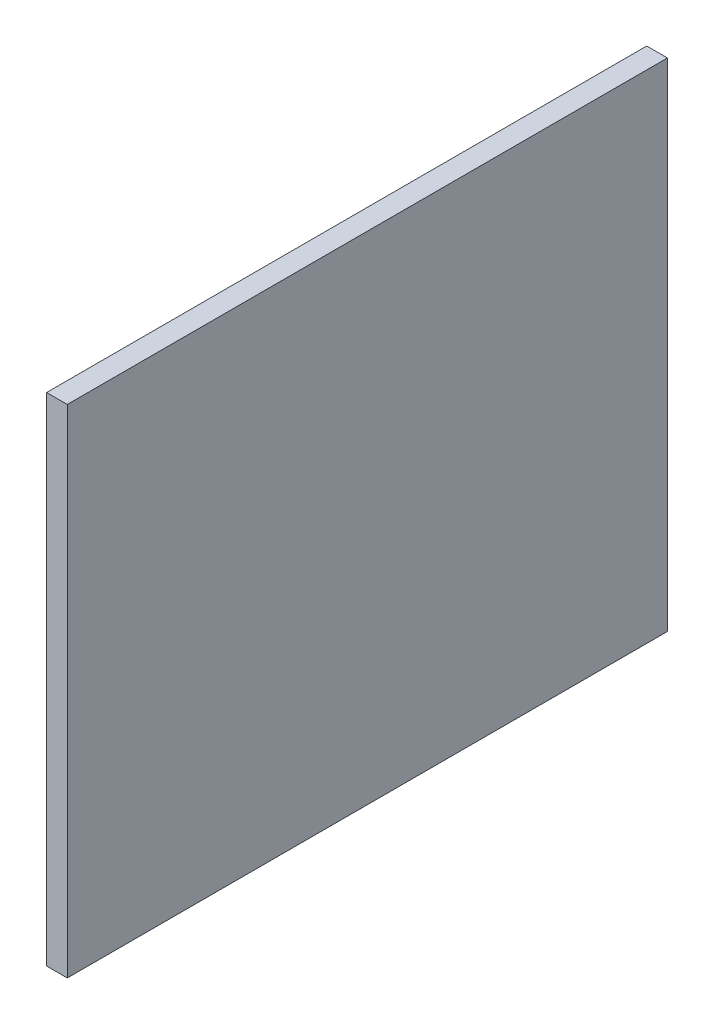
ISO-10303-21;
HEADER;
FILE_DESCRIPTION(('STEP AP214'),'2;1');
FILE_NAME('part.step','',(''),(''),'','','');
FILE_SCHEMA(('AUTOMOTIVE_DESIGN { 1 0 10303 214 1 1 1 1 }'));
ENDSEC;
DATA;
#1=APPLICATION_CONTEXT('core data for automotive mechanical design processes');
#2=APPLICATION_PROTOCOL_DEFINITION('international standard','automotive_design',2000,#1);
#3=PRODUCT_CONTEXT('',#1,'mechanical');
#4=PRODUCT('Part','Part','',(#3));
#5=PRODUCT_RELATED_PRODUCT_CATEGORY('part','',(#4));
#6=PRODUCT_DEFINITION_FORMATION('','',#4);
#7=PRODUCT_DEFINITION_CONTEXT('part definition',#1,'design');
#8=PRODUCT_DEFINITION('design','',#6,#7);
#9=PRODUCT_DEFINITION_SHAPE('','',#8);
#10=(LENGTH_UNIT() NAMED_UNIT(*) SI_UNIT(.MILLI.,.METRE.));
#11=(NAMED_UNIT(*) PLANE_ANGLE_UNIT() SI_UNIT($,.RADIAN.));
#12=(NAMED_UNIT(*) SI_UNIT($,.STERADIAN.) SOLID_ANGLE_UNIT());
#13=UNCERTAINTY_MEASURE_WITH_UNIT(LENGTH_MEASURE(1.E-05),#10,'distance_accuracy_value','');
#14=(GEOMETRIC_REPRESENTATION_CONTEXT(3) GLOBAL_UNCERTAINTY_ASSIGNED_CONTEXT((#13)) GLOBAL_UNIT_ASSIGNED_CONTEXT((#10,
#11,#12)) REPRESENTATION_CONTEXT('',''));
#15=CARTESIAN_POINT('',(0.,0.,0.));
#16=DIRECTION('',(0.,0.,1.));
#17=DIRECTION('',(1.,0.,0.));
#18=AXIS2_PLACEMENT_3D('',#15,#16,#17);
#19=CARTESIAN_POINT('',(3.,32.2129116588718,20.2867132867133));
#20=DIRECTION('',(0.,0.,-1.));
#21=DIRECTION('',(-1.,0.,0.));
#22=AXIS2_PLACEMENT_3D('',#19,#20,#21);
#23=PLANE('',#22);
#24=DIRECTION('',(0.,-1.,0.));
#25=VECTOR('',#24,1.);
#26=CARTESIAN_POINT('',(0.,32.2129116588718,20.2867132867133));
#27=LINE('',#26,#25);
#28=CARTESIAN_POINT('',(0.,32.2129116588718,20.2867132867133));
#29=VERTEX_POINT('',#28);
#30=CARTESIAN_POINT('',(0.,-39.7870883411282,20.2867132867133));
#31=VERTEX_POINT('',#30);
#32=EDGE_CURVE('E96',#29,#31,#27,.T.);
#33=ORIENTED_EDGE('',*,*,#32,.T.);
#34=DIRECTION('',(-1.,0.,0.));
#35=VECTOR('',#34,1.);
#36=CARTESIAN_POINT('',(3.,-39.7870883411282,20.2867132867133));
#37=LINE('',#36,#35);
#38=CARTESIAN_POINT('',(3.,-39.7870883411282,20.2867132867133));
#39=VERTEX_POINT('',#38);
#40=EDGE_CURVE('E11',#39,#31,#37,.T.);
#41=ORIENTED_EDGE('',*,*,#40,.F.);
#42=DIRECTION('',(0.,-1.,0.));
#43=VECTOR('',#42,1.);
#44=CARTESIAN_POINT('',(3.,32.2129116588718,20.2867132867133));
#45=LINE('',#44,#43);
#46=CARTESIAN_POINT('',(3.,32.2129116588718,20.2867132867133));
#47=VERTEX_POINT('',#46);
#48=EDGE_CURVE('E84',#47,#39,#45,.T.);
#49=ORIENTED_EDGE('',*,*,#48,.F.);
#50=DIRECTION('',(-1.,0.,0.));
#51=VECTOR('',#50,1.);
#52=CARTESIAN_POINT('',(3.,32.2129116588718,20.2867132867133));
#53=LINE('',#52,#51);
#54=EDGE_CURVE('E92',#47,#29,#53,.T.);
#55=ORIENTED_EDGE('',*,*,#54,.T.);
#56=EDGE_LOOP('',(#33,#41,#49,#55));
#57=FACE_BOUND('',#56,.T.);
#58=ADVANCED_FACE('F33',(#57),#23,.F.);
#59=CARTESIAN_POINT('',(3.,-39.7870883411282,20.2867132867133));
#60=DIRECTION('',(0.,1.,0.));
#61=DIRECTION('',(0.,0.,1.));
#62=AXIS2_PLACEMENT_3D('',#59,#60,#61);
#63=PLANE('',#62);
#64=DIRECTION('',(0.,0.,-1.));
#65=VECTOR('',#64,1.);
#66=CARTESIAN_POINT('',(0.,-39.7870883411282,20.2867132867133));
#67=LINE('',#66,#65);
#68=CARTESIAN_POINT('',(0.,-39.7870883411282,-66.7132867132867));
#69=VERTEX_POINT('',#68);
#70=EDGE_CURVE('E88',#31,#69,#67,.T.);
#71=ORIENTED_EDGE('',*,*,#70,.T.);
#72=DIRECTION('',(-1.,0.,0.));
#73=VECTOR('',#72,1.);
#74=CARTESIAN_POINT('',(3.,-39.7870883411282,-66.7132867132867));
#75=LINE('',#74,#73);
#76=CARTESIAN_POINT('',(3.,-39.7870883411282,-66.7132867132867));
#77=VERTEX_POINT('',#76);
#78=EDGE_CURVE('E41',#77,#69,#75,.T.);
#79=ORIENTED_EDGE('',*,*,#78,.F.);
#80=DIRECTION('',(0.,0.,-1.));
#81=VECTOR('',#80,1.);
#82=CARTESIAN_POINT('',(3.,-39.7870883411282,20.2867132867133));
#83=LINE('',#82,#81);
#84=EDGE_CURVE('E79',#39,#77,#83,.T.);
#85=ORIENTED_EDGE('',*,*,#84,.F.);
#86=ORIENTED_EDGE('',*,*,#40,.T.);
#87=EDGE_LOOP('',(#71,#79,#85,#86));
#88=FACE_BOUND('',#87,.T.);
#89=ADVANCED_FACE('F87',(#88),#63,.F.);
#90=CARTESIAN_POINT('',(3.,32.2129116588718,-66.7132867132867));
#91=DIRECTION('',(0.,0.,1.));
#92=DIRECTION('',(1.,0.,0.));
#93=AXIS2_PLACEMENT_3D('',#90,#91,#92);
#94=PLANE('',#93);
#95=DIRECTION('',(0.,1.,0.));
#96=VECTOR('',#95,1.);
#97=CARTESIAN_POINT('',(0.,32.2129116588718,-66.7132867132867));
#98=LINE('',#97,#96);
#99=CARTESIAN_POINT('',(0.,32.2129116588718,-66.7132867132867));
#100=VERTEX_POINT('',#99);
#101=EDGE_CURVE('E66',#69,#100,#98,.T.);
#102=ORIENTED_EDGE('',*,*,#101,.T.);
#103=DIRECTION('',(-1.,0.,0.));
#104=VECTOR('',#103,1.);
#105=CARTESIAN_POINT('',(3.,32.2129116588718,-66.7132867132867));
#106=LINE('',#105,#104);
#107=CARTESIAN_POINT('',(3.,32.2129116588718,-66.7132867132867));
#108=VERTEX_POINT('',#107);
#109=EDGE_CURVE('E89',#108,#100,#106,.T.);
#110=ORIENTED_EDGE('',*,*,#109,.F.);
#111=DIRECTION('',(0.,1.,0.));
#112=VECTOR('',#111,1.);
#113=CARTESIAN_POINT('',(3.,32.2129116588718,-66.7132867132867));
#114=LINE('',#113,#112);
#115=EDGE_CURVE('E82',#77,#108,#114,.T.);
#116=ORIENTED_EDGE('',*,*,#115,.F.);
#117=ORIENTED_EDGE('',*,*,#78,.T.);
#118=EDGE_LOOP('',(#102,#110,#116,#117));
#119=FACE_BOUND('',#118,.T.);
#120=ADVANCED_FACE('F90',(#119),#94,.F.);
#121=CARTESIAN_POINT('',(3.,32.2129116588718,20.2867132867133));
#122=DIRECTION('',(0.,-1.,0.));
#123=DIRECTION('',(0.,0.,-1.));
#124=AXIS2_PLACEMENT_3D('',#121,#122,#123);
#125=PLANE('',#124);
#126=DIRECTION('',(0.,0.,1.));
#127=VECTOR('',#126,1.);
#128=CARTESIAN_POINT('',(0.,32.2129116588718,20.2867132867133));
#129=LINE('',#128,#127);
#130=EDGE_CURVE('E72',#100,#29,#129,.T.);
#131=ORIENTED_EDGE('',*,*,#130,.T.);
#132=ORIENTED_EDGE('',*,*,#54,.F.);
#133=DIRECTION('',(0.,0.,1.));
#134=VECTOR('',#133,1.);
#135=CARTESIAN_POINT('',(3.,32.2129116588718,20.2867132867133));
#136=LINE('',#135,#134);
#137=EDGE_CURVE('E49',#108,#47,#136,.T.);
#138=ORIENTED_EDGE('',*,*,#137,.F.);
#139=ORIENTED_EDGE('',*,*,#109,.T.);
#140=EDGE_LOOP('',(#131,#132,#138,#139));
#141=FACE_BOUND('',#140,.T.);
#142=ADVANCED_FACE('F103',(#141),#125,.F.);
#143=CARTESIAN_POINT('',(3.,0.,0.));
#144=DIRECTION('',(1.,0.,0.));
#145=DIRECTION('',(0.,0.,-1.));
#146=AXIS2_PLACEMENT_3D('',#143,#144,#145);
#147=PLANE('',#146);
#148=ORIENTED_EDGE('',*,*,#48,.T.);
#149=ORIENTED_EDGE('',*,*,#84,.T.);
#150=ORIENTED_EDGE('',*,*,#115,.T.);
#151=ORIENTED_EDGE('',*,*,#137,.T.);
#152=EDGE_LOOP('',(#148,#149,#150,#151));
#153=FACE_BOUND('',#152,.T.);
#154=ADVANCED_FACE('F80',(#153),#147,.T.);
#155=CARTESIAN_POINT('',(0.,0.,0.));
#156=DIRECTION('',(1.,0.,0.));
#157=DIRECTION('',(0.,0.,-1.));
#158=AXIS2_PLACEMENT_3D('',#155,#156,#157);
#159=PLANE('',#158);
#160=ORIENTED_EDGE('',*,*,#32,.F.);
#161=ORIENTED_EDGE('',*,*,#130,.F.);
#162=ORIENTED_EDGE('',*,*,#101,.F.);
#163=ORIENTED_EDGE('',*,*,#70,.F.);
#164=EDGE_LOOP('',(#160,#161,#162,#163));
#165=FACE_BOUND('',#164,.T.);
#166=ADVANCED_FACE('F106',(#165),#159,.F.);
#167=CLOSED_SHELL('',(#58,#89,#120,#142,#154,#166));
#168=MANIFOLD_SOLID_BREP('B2',#167);
#169=ADVANCED_BREP_SHAPE_REPRESENTATION('',(#18,#168),#14);
#170=SHAPE_DEFINITION_REPRESENTATION(#9,#169);
ENDSEC;
END-ISO-10303-21;
